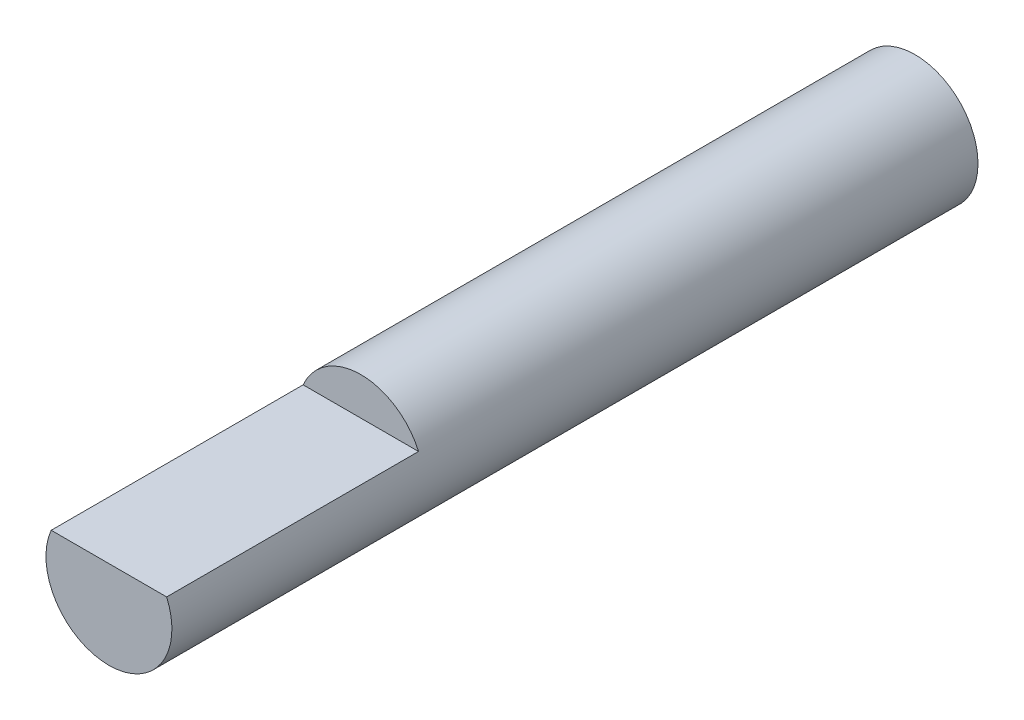
ISO-10303-21;
HEADER;
FILE_DESCRIPTION(('STEP AP214'),'2;1');
FILE_NAME('part.step','',(''),(''),'','','');
FILE_SCHEMA(('AUTOMOTIVE_DESIGN { 1 0 10303 214 1 1 1 1 }'));
ENDSEC;
DATA;
#1=APPLICATION_CONTEXT('core data for automotive mechanical design processes');
#2=APPLICATION_PROTOCOL_DEFINITION('international standard','automotive_design',2000,#1);
#3=PRODUCT_CONTEXT('',#1,'mechanical');
#4=PRODUCT('Part','Part','',(#3));
#5=PRODUCT_RELATED_PRODUCT_CATEGORY('part','',(#4));
#6=PRODUCT_DEFINITION_FORMATION('','',#4);
#7=PRODUCT_DEFINITION_CONTEXT('part definition',#1,'design');
#8=PRODUCT_DEFINITION('design','',#6,#7);
#9=PRODUCT_DEFINITION_SHAPE('','',#8);
#10=(LENGTH_UNIT() NAMED_UNIT(*) SI_UNIT(.MILLI.,.METRE.));
#11=(NAMED_UNIT(*) PLANE_ANGLE_UNIT() SI_UNIT($,.RADIAN.));
#12=(NAMED_UNIT(*) SI_UNIT($,.STERADIAN.) SOLID_ANGLE_UNIT());
#13=UNCERTAINTY_MEASURE_WITH_UNIT(LENGTH_MEASURE(1.E-05),#10,'distance_accuracy_value','');
#14=(GEOMETRIC_REPRESENTATION_CONTEXT(3) GLOBAL_UNCERTAINTY_ASSIGNED_CONTEXT((#13)) GLOBAL_UNIT_ASSIGNED_CONTEXT((#10,
#11,#12)) REPRESENTATION_CONTEXT('',''));
#15=CARTESIAN_POINT('',(0.,0.,0.));
#16=DIRECTION('',(0.,0.,1.));
#17=DIRECTION('',(1.,0.,0.));
#18=AXIS2_PLACEMENT_3D('',#15,#16,#17);
#19=CARTESIAN_POINT('',(0.,0.,32.));
#20=DIRECTION('',(0.,0.,-1.));
#21=DIRECTION('',(-1.,0.,0.));
#22=AXIS2_PLACEMENT_3D('',#19,#20,#21);
#23=CYLINDRICAL_SURFACE('',#22,2.5);
#24=CARTESIAN_POINT('',(0.,0.,32.));
#25=DIRECTION('',(0.,0.,1.));
#26=DIRECTION('',(1.,0.,0.));
#27=AXIS2_PLACEMENT_3D('',#24,#25,#26);
#28=CIRCLE('',#27,2.5);
#29=CARTESIAN_POINT('',(-2.29128784747792,1.,32.));
#30=VERTEX_POINT('',#29);
#31=CARTESIAN_POINT('',(2.29128784747792,1.,32.));
#32=VERTEX_POINT('',#31);
#33=EDGE_CURVE('E11',#30,#32,#28,.T.);
#34=ORIENTED_EDGE('',*,*,#33,.F.);
#35=DIRECTION('',(0.,0.,1.));
#36=VECTOR('',#35,1.);
#37=CARTESIAN_POINT('',(-2.29128784747792,1.,22.));
#38=LINE('',#37,#36);
#39=CARTESIAN_POINT('',(-2.29128784747792,1.,22.));
#40=VERTEX_POINT('',#39);
#41=EDGE_CURVE('E54',#40,#30,#38,.T.);
#42=ORIENTED_EDGE('',*,*,#41,.F.);
#43=CARTESIAN_POINT('',(0.,0.,22.));
#44=DIRECTION('',(0.,0.,1.));
#45=DIRECTION('',(1.,0.,0.));
#46=AXIS2_PLACEMENT_3D('',#43,#44,#45);
#47=CIRCLE('',#46,2.5);
#48=CARTESIAN_POINT('',(2.29128784747792,1.,22.));
#49=VERTEX_POINT('',#48);
#50=EDGE_CURVE('E70',#49,#40,#47,.T.);
#51=ORIENTED_EDGE('',*,*,#50,.F.);
#52=DIRECTION('',(0.,0.,1.));
#53=VECTOR('',#52,1.);
#54=CARTESIAN_POINT('',(2.29128784747792,1.,22.));
#55=LINE('',#54,#53);
#56=EDGE_CURVE('E60',#49,#32,#55,.T.);
#57=ORIENTED_EDGE('',*,*,#56,.T.);
#58=EDGE_LOOP('',(#34,#42,#51,#57));
#59=FACE_BOUND('',#58,.T.);
#60=CARTESIAN_POINT('',(0.,0.,0.));
#61=DIRECTION('',(0.,0.,1.));
#62=DIRECTION('',(1.,0.,0.));
#63=AXIS2_PLACEMENT_3D('',#60,#61,#62);
#64=CIRCLE('',#63,2.5);
#65=CARTESIAN_POINT('',(2.5,0.,0.));
#66=VERTEX_POINT('',#65);
#67=EDGE_CURVE('E42',#66,#66,#64,.T.);
#68=ORIENTED_EDGE('',*,*,#67,.T.);
#69=EDGE_LOOP('',(#68));
#70=FACE_BOUND('',#69,.T.);
#71=ADVANCED_FACE('F39',(#59,#70),#23,.T.);
#72=CARTESIAN_POINT('',(0.,0.,32.));
#73=DIRECTION('',(0.,0.,1.));
#74=DIRECTION('',(1.,0.,0.));
#75=AXIS2_PLACEMENT_3D('',#72,#73,#74);
#76=PLANE('',#75);
#77=DIRECTION('',(1.,0.,0.));
#78=VECTOR('',#77,1.);
#79=CARTESIAN_POINT('',(-2.29128784747792,1.,32.));
#80=LINE('',#79,#78);
#81=EDGE_CURVE('E65',#30,#32,#80,.T.);
#82=ORIENTED_EDGE('',*,*,#81,.F.);
#83=ORIENTED_EDGE('',*,*,#33,.T.);
#84=EDGE_LOOP('',(#82,#83));
#85=FACE_BOUND('',#84,.T.);
#86=ADVANCED_FACE('F77',(#85),#76,.T.);
#87=CARTESIAN_POINT('',(0.,0.,0.));
#88=DIRECTION('',(0.,0.,1.));
#89=DIRECTION('',(1.,0.,0.));
#90=AXIS2_PLACEMENT_3D('',#87,#88,#89);
#91=PLANE('',#90);
#92=ORIENTED_EDGE('',*,*,#67,.F.);
#93=EDGE_LOOP('',(#92));
#94=FACE_BOUND('',#93,.T.);
#95=ADVANCED_FACE('F79',(#94),#91,.F.);
#96=CARTESIAN_POINT('',(-2.29128784747792,1.,22.));
#97=DIRECTION('',(0.,-1.,0.));
#98=DIRECTION('',(0.,0.,-1.));
#99=AXIS2_PLACEMENT_3D('',#96,#97,#98);
#100=PLANE('',#99);
#101=ORIENTED_EDGE('',*,*,#81,.T.);
#102=ORIENTED_EDGE('',*,*,#56,.F.);
#103=DIRECTION('',(1.,0.,0.));
#104=VECTOR('',#103,1.);
#105=CARTESIAN_POINT('',(-2.29128784747792,1.,22.));
#106=LINE('',#105,#104);
#107=EDGE_CURVE('E94',#40,#49,#106,.T.);
#108=ORIENTED_EDGE('',*,*,#107,.F.);
#109=ORIENTED_EDGE('',*,*,#41,.T.);
#110=EDGE_LOOP('',(#101,#102,#108,#109));
#111=FACE_BOUND('',#110,.T.);
#112=ADVANCED_FACE('F66',(#111),#100,.F.);
#113=CARTESIAN_POINT('',(0.,0.,22.));
#114=DIRECTION('',(0.,0.,1.));
#115=DIRECTION('',(1.,0.,0.));
#116=AXIS2_PLACEMENT_3D('',#113,#114,#115);
#117=PLANE('',#116);
#118=ORIENTED_EDGE('',*,*,#50,.T.);
#119=ORIENTED_EDGE('',*,*,#107,.T.);
#120=EDGE_LOOP('',(#118,#119));
#121=FACE_BOUND('',#120,.T.);
#122=ADVANCED_FACE('F89',(#121),#117,.T.);
#123=CLOSED_SHELL('',(#71,#86,#95,#112,#122));
#124=MANIFOLD_SOLID_BREP('B2',#123);
#125=ADVANCED_BREP_SHAPE_REPRESENTATION('',(#18,#124),#14);
#126=SHAPE_DEFINITION_REPRESENTATION(#9,#125);
ENDSEC;
END-ISO-10303-21;
